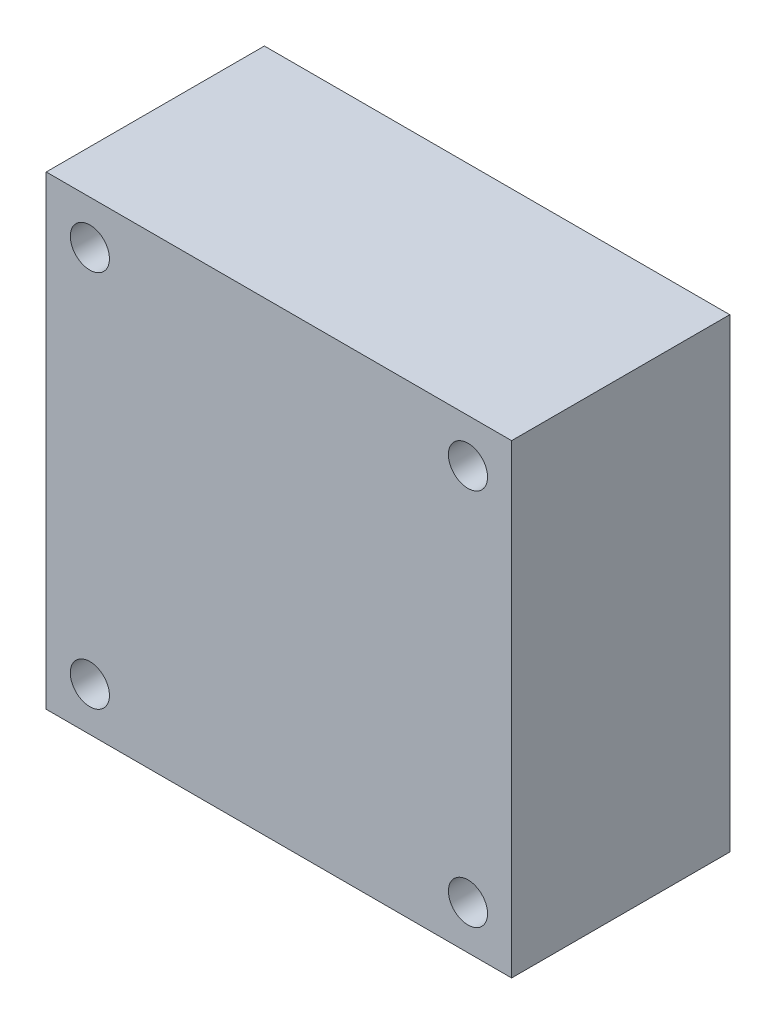
ISO-10303-21;
HEADER;
FILE_DESCRIPTION(('STEP AP214'),'2;1');
FILE_NAME('part.step','',(''),(''),'','','');
FILE_SCHEMA(('AUTOMOTIVE_DESIGN { 1 0 10303 214 1 1 1 1 }'));
ENDSEC;
DATA;
#1=APPLICATION_CONTEXT('core data for automotive mechanical design processes');
#2=APPLICATION_PROTOCOL_DEFINITION('international standard','automotive_design',2000,#1);
#3=PRODUCT_CONTEXT('',#1,'mechanical');
#4=PRODUCT('Part','Part','',(#3));
#5=PRODUCT_RELATED_PRODUCT_CATEGORY('part','',(#4));
#6=PRODUCT_DEFINITION_FORMATION('','',#4);
#7=PRODUCT_DEFINITION_CONTEXT('part definition',#1,'design');
#8=PRODUCT_DEFINITION('design','',#6,#7);
#9=PRODUCT_DEFINITION_SHAPE('','',#8);
#10=(LENGTH_UNIT() NAMED_UNIT(*) SI_UNIT(.MILLI.,.METRE.));
#11=(NAMED_UNIT(*) PLANE_ANGLE_UNIT() SI_UNIT($,.RADIAN.));
#12=(NAMED_UNIT(*) SI_UNIT($,.STERADIAN.) SOLID_ANGLE_UNIT());
#13=UNCERTAINTY_MEASURE_WITH_UNIT(LENGTH_MEASURE(1.E-05),#10,'distance_accuracy_value','');
#14=(GEOMETRIC_REPRESENTATION_CONTEXT(3) GLOBAL_UNCERTAINTY_ASSIGNED_CONTEXT((#13)) GLOBAL_UNIT_ASSIGNED_CONTEXT((#10,
#11,#12)) REPRESENTATION_CONTEXT('',''));
#15=CARTESIAN_POINT('',(0.,0.,0.));
#16=DIRECTION('',(0.,0.,1.));
#17=DIRECTION('',(1.,0.,0.));
#18=AXIS2_PLACEMENT_3D('',#15,#16,#17);
#19=CARTESIAN_POINT('',(0.,0.,15.));
#20=DIRECTION('',(0.,0.,1.));
#21=DIRECTION('',(1.,0.,0.));
#22=AXIS2_PLACEMENT_3D('',#19,#20,#21);
#23=PLANE('',#22);
#24=CARTESIAN_POINT('',(13.,13.,15.));
#25=DIRECTION('',(0.,0.,1.));
#26=DIRECTION('',(1.,0.,0.));
#27=AXIS2_PLACEMENT_3D('',#24,#25,#26);
#28=CIRCLE('',#27,1.3455497382199);
#29=CARTESIAN_POINT('',(14.3455497382199,13.,15.));
#30=VERTEX_POINT('',#29);
#31=EDGE_CURVE('E121',#30,#30,#28,.T.);
#32=ORIENTED_EDGE('',*,*,#31,.F.);
#33=EDGE_LOOP('',(#32));
#34=FACE_BOUND('',#33,.T.);
#35=CARTESIAN_POINT('',(-13.,-13.,15.));
#36=DIRECTION('',(0.,0.,1.));
#37=DIRECTION('',(1.,0.,0.));
#38=AXIS2_PLACEMENT_3D('',#35,#36,#37);
#39=CIRCLE('',#38,1.3455497382199);
#40=CARTESIAN_POINT('',(-11.6544502617801,-13.,15.));
#41=VERTEX_POINT('',#40);
#42=EDGE_CURVE('E100',#41,#41,#39,.T.);
#43=ORIENTED_EDGE('',*,*,#42,.F.);
#44=EDGE_LOOP('',(#43));
#45=FACE_BOUND('',#44,.T.);
#46=DIRECTION('',(0.,-1.,0.));
#47=VECTOR('',#46,1.);
#48=CARTESIAN_POINT('',(-16.,-16.,15.));
#49=LINE('',#48,#47);
#50=CARTESIAN_POINT('',(-16.,16.,15.));
#51=VERTEX_POINT('',#50);
#52=CARTESIAN_POINT('',(-16.,-16.,15.));
#53=VERTEX_POINT('',#52);
#54=EDGE_CURVE('E85',#51,#53,#49,.T.);
#55=ORIENTED_EDGE('',*,*,#54,.T.);
#56=DIRECTION('',(1.,0.,0.));
#57=VECTOR('',#56,1.);
#58=CARTESIAN_POINT('',(16.,-16.,15.));
#59=LINE('',#58,#57);
#60=CARTESIAN_POINT('',(16.,-16.,15.));
#61=VERTEX_POINT('',#60);
#62=EDGE_CURVE('E80',#53,#61,#59,.T.);
#63=ORIENTED_EDGE('',*,*,#62,.T.);
#64=DIRECTION('',(0.,1.,0.));
#65=VECTOR('',#64,1.);
#66=CARTESIAN_POINT('',(16.,-16.,15.));
#67=LINE('',#66,#65);
#68=CARTESIAN_POINT('',(16.,16.,15.));
#69=VERTEX_POINT('',#68);
#70=EDGE_CURVE('E83',#61,#69,#67,.T.);
#71=ORIENTED_EDGE('',*,*,#70,.T.);
#72=DIRECTION('',(-1.,0.,0.));
#73=VECTOR('',#72,1.);
#74=CARTESIAN_POINT('',(16.,16.,15.));
#75=LINE('',#74,#73);
#76=EDGE_CURVE('E50',#69,#51,#75,.T.);
#77=ORIENTED_EDGE('',*,*,#76,.T.);
#78=EDGE_LOOP('',(#55,#63,#71,#77));
#79=FACE_BOUND('',#78,.T.);
#80=CARTESIAN_POINT('',(13.,-13.,15.));
#81=DIRECTION('',(0.,0.,1.));
#82=DIRECTION('',(-1.,0.,0.));
#83=AXIS2_PLACEMENT_3D('',#80,#81,#82);
#84=CIRCLE('',#83,1.3455497382199);
#85=CARTESIAN_POINT('',(11.6544502617801,-13.,15.));
#86=VERTEX_POINT('',#85);
#87=EDGE_CURVE('E115',#86,#86,#84,.T.);
#88=ORIENTED_EDGE('',*,*,#87,.F.);
#89=EDGE_LOOP('',(#88));
#90=FACE_BOUND('',#89,.T.);
#91=CARTESIAN_POINT('',(-13.,13.,15.));
#92=DIRECTION('',(0.,0.,1.));
#93=DIRECTION('',(-1.,0.,0.));
#94=AXIS2_PLACEMENT_3D('',#91,#92,#93);
#95=CIRCLE('',#94,1.3455497382199);
#96=CARTESIAN_POINT('',(-14.3455497382199,13.,15.));
#97=VERTEX_POINT('',#96);
#98=EDGE_CURVE('E127',#97,#97,#95,.T.);
#99=ORIENTED_EDGE('',*,*,#98,.F.);
#100=EDGE_LOOP('',(#99));
#101=FACE_BOUND('',#100,.T.);
#102=ADVANCED_FACE('F33',(#34,#45,#79,#90,#101),#23,.T.);
#103=CARTESIAN_POINT('',(0.,0.,0.));
#104=DIRECTION('',(0.,0.,1.));
#105=DIRECTION('',(1.,0.,0.));
#106=AXIS2_PLACEMENT_3D('',#103,#104,#105);
#107=PLANE('',#106);
#108=DIRECTION('',(0.,-1.,0.));
#109=VECTOR('',#108,1.);
#110=CARTESIAN_POINT('',(-16.,-16.,0.));
#111=LINE('',#110,#109);
#112=CARTESIAN_POINT('',(-16.,16.,0.));
#113=VERTEX_POINT('',#112);
#114=CARTESIAN_POINT('',(-16.,-16.,0.));
#115=VERTEX_POINT('',#114);
#116=EDGE_CURVE('E97',#113,#115,#111,.T.);
#117=ORIENTED_EDGE('',*,*,#116,.F.);
#118=DIRECTION('',(-1.,0.,0.));
#119=VECTOR('',#118,1.);
#120=CARTESIAN_POINT('',(16.,16.,0.));
#121=LINE('',#120,#119);
#122=CARTESIAN_POINT('',(16.,16.,0.));
#123=VERTEX_POINT('',#122);
#124=EDGE_CURVE('E73',#123,#113,#121,.T.);
#125=ORIENTED_EDGE('',*,*,#124,.F.);
#126=DIRECTION('',(0.,1.,0.));
#127=VECTOR('',#126,1.);
#128=CARTESIAN_POINT('',(16.,-16.,0.));
#129=LINE('',#128,#127);
#130=CARTESIAN_POINT('',(16.,-16.,0.));
#131=VERTEX_POINT('',#130);
#132=EDGE_CURVE('E67',#131,#123,#129,.T.);
#133=ORIENTED_EDGE('',*,*,#132,.F.);
#134=DIRECTION('',(1.,0.,0.));
#135=VECTOR('',#134,1.);
#136=CARTESIAN_POINT('',(16.,-16.,0.));
#137=LINE('',#136,#135);
#138=EDGE_CURVE('E89',#115,#131,#137,.T.);
#139=ORIENTED_EDGE('',*,*,#138,.F.);
#140=EDGE_LOOP('',(#117,#125,#133,#139));
#141=FACE_BOUND('',#140,.T.);
#142=CARTESIAN_POINT('',(-13.,-13.,0.));
#143=DIRECTION('',(0.,0.,1.));
#144=DIRECTION('',(1.,0.,0.));
#145=AXIS2_PLACEMENT_3D('',#142,#143,#144);
#146=CIRCLE('',#145,1.3455497382199);
#147=CARTESIAN_POINT('',(-11.6544502617801,-13.,0.));
#148=VERTEX_POINT('',#147);
#149=EDGE_CURVE('E112',#148,#148,#146,.T.);
#150=ORIENTED_EDGE('',*,*,#149,.T.);
#151=EDGE_LOOP('',(#150));
#152=FACE_BOUND('',#151,.T.);
#153=CARTESIAN_POINT('',(13.,-13.,0.));
#154=DIRECTION('',(0.,0.,1.));
#155=DIRECTION('',(-1.,0.,0.));
#156=AXIS2_PLACEMENT_3D('',#153,#154,#155);
#157=CIRCLE('',#156,1.3455497382199);
#158=CARTESIAN_POINT('',(11.6544502617801,-13.,0.));
#159=VERTEX_POINT('',#158);
#160=EDGE_CURVE('E118',#159,#159,#157,.T.);
#161=ORIENTED_EDGE('',*,*,#160,.T.);
#162=EDGE_LOOP('',(#161));
#163=FACE_BOUND('',#162,.T.);
#164=CARTESIAN_POINT('',(13.,13.,0.));
#165=DIRECTION('',(0.,0.,1.));
#166=DIRECTION('',(1.,0.,0.));
#167=AXIS2_PLACEMENT_3D('',#164,#165,#166);
#168=CIRCLE('',#167,1.3455497382199);
#169=CARTESIAN_POINT('',(14.3455497382199,13.,0.));
#170=VERTEX_POINT('',#169);
#171=EDGE_CURVE('E124',#170,#170,#168,.T.);
#172=ORIENTED_EDGE('',*,*,#171,.T.);
#173=EDGE_LOOP('',(#172));
#174=FACE_BOUND('',#173,.T.);
#175=CARTESIAN_POINT('',(-13.,13.,0.));
#176=DIRECTION('',(0.,0.,1.));
#177=DIRECTION('',(-1.,0.,0.));
#178=AXIS2_PLACEMENT_3D('',#175,#176,#177);
#179=CIRCLE('',#178,1.3455497382199);
#180=CARTESIAN_POINT('',(-14.3455497382199,13.,0.));
#181=VERTEX_POINT('',#180);
#182=EDGE_CURVE('E130',#181,#181,#179,.T.);
#183=ORIENTED_EDGE('',*,*,#182,.T.);
#184=EDGE_LOOP('',(#183));
#185=FACE_BOUND('',#184,.T.);
#186=ADVANCED_FACE('F108',(#141,#152,#163,#174,#185),#107,.F.);
#187=CARTESIAN_POINT('',(-16.,-16.,15.));
#188=DIRECTION('',(1.,0.,0.));
#189=DIRECTION('',(0.,0.,-1.));
#190=AXIS2_PLACEMENT_3D('',#187,#188,#189);
#191=PLANE('',#190);
#192=ORIENTED_EDGE('',*,*,#116,.T.);
#193=DIRECTION('',(0.,0.,-1.));
#194=VECTOR('',#193,1.);
#195=CARTESIAN_POINT('',(-16.,-16.,15.));
#196=LINE('',#195,#194);
#197=EDGE_CURVE('E11',#53,#115,#196,.T.);
#198=ORIENTED_EDGE('',*,*,#197,.F.);
#199=ORIENTED_EDGE('',*,*,#54,.F.);
#200=DIRECTION('',(0.,0.,-1.));
#201=VECTOR('',#200,1.);
#202=CARTESIAN_POINT('',(-16.,16.,15.));
#203=LINE('',#202,#201);
#204=EDGE_CURVE('E93',#51,#113,#203,.T.);
#205=ORIENTED_EDGE('',*,*,#204,.T.);
#206=EDGE_LOOP('',(#192,#198,#199,#205));
#207=FACE_BOUND('',#206,.T.);
#208=ADVANCED_FACE('F35',(#207),#191,.F.);
#209=CARTESIAN_POINT('',(16.,-16.,15.));
#210=DIRECTION('',(0.,1.,0.));
#211=DIRECTION('',(0.,0.,1.));
#212=AXIS2_PLACEMENT_3D('',#209,#210,#211);
#213=PLANE('',#212);
#214=ORIENTED_EDGE('',*,*,#138,.T.);
#215=DIRECTION('',(0.,0.,-1.));
#216=VECTOR('',#215,1.);
#217=CARTESIAN_POINT('',(16.,-16.,15.));
#218=LINE('',#217,#216);
#219=EDGE_CURVE('E42',#61,#131,#218,.T.);
#220=ORIENTED_EDGE('',*,*,#219,.F.);
#221=ORIENTED_EDGE('',*,*,#62,.F.);
#222=ORIENTED_EDGE('',*,*,#197,.T.);
#223=EDGE_LOOP('',(#214,#220,#221,#222));
#224=FACE_BOUND('',#223,.T.);
#225=ADVANCED_FACE('F88',(#224),#213,.F.);
#226=CARTESIAN_POINT('',(16.,-16.,15.));
#227=DIRECTION('',(-1.,0.,0.));
#228=DIRECTION('',(0.,0.,1.));
#229=AXIS2_PLACEMENT_3D('',#226,#227,#228);
#230=PLANE('',#229);
#231=ORIENTED_EDGE('',*,*,#132,.T.);
#232=DIRECTION('',(0.,0.,-1.));
#233=VECTOR('',#232,1.);
#234=CARTESIAN_POINT('',(16.,16.,15.));
#235=LINE('',#234,#233);
#236=EDGE_CURVE('E90',#69,#123,#235,.T.);
#237=ORIENTED_EDGE('',*,*,#236,.F.);
#238=ORIENTED_EDGE('',*,*,#70,.F.);
#239=ORIENTED_EDGE('',*,*,#219,.T.);
#240=EDGE_LOOP('',(#231,#237,#238,#239));
#241=FACE_BOUND('',#240,.T.);
#242=ADVANCED_FACE('F91',(#241),#230,.F.);
#243=CARTESIAN_POINT('',(16.,16.,15.));
#244=DIRECTION('',(0.,-1.,0.));
#245=DIRECTION('',(0.,0.,-1.));
#246=AXIS2_PLACEMENT_3D('',#243,#244,#245);
#247=PLANE('',#246);
#248=ORIENTED_EDGE('',*,*,#124,.T.);
#249=ORIENTED_EDGE('',*,*,#204,.F.);
#250=ORIENTED_EDGE('',*,*,#76,.F.);
#251=ORIENTED_EDGE('',*,*,#236,.T.);
#252=EDGE_LOOP('',(#248,#249,#250,#251));
#253=FACE_BOUND('',#252,.T.);
#254=ADVANCED_FACE('F105',(#253),#247,.F.);
#255=CARTESIAN_POINT('',(-13.,-13.,15.));
#256=DIRECTION('',(0.,0.,-1.));
#257=DIRECTION('',(-1.,0.,0.));
#258=AXIS2_PLACEMENT_3D('',#255,#256,#257);
#259=CYLINDRICAL_SURFACE('',#258,1.3455497382199);
#260=ORIENTED_EDGE('',*,*,#42,.T.);
#261=EDGE_LOOP('',(#260));
#262=FACE_BOUND('',#261,.T.);
#263=ORIENTED_EDGE('',*,*,#149,.F.);
#264=EDGE_LOOP('',(#263));
#265=FACE_BOUND('',#264,.T.);
#266=ADVANCED_FACE('F149',(#262,#265),#259,.F.);
#267=CARTESIAN_POINT('',(13.,-13.,15.));
#268=DIRECTION('',(0.,0.,-1.));
#269=DIRECTION('',(-1.,0.,0.));
#270=AXIS2_PLACEMENT_3D('',#267,#268,#269);
#271=CYLINDRICAL_SURFACE('',#270,1.3455497382199);
#272=ORIENTED_EDGE('',*,*,#87,.T.);
#273=EDGE_LOOP('',(#272));
#274=FACE_BOUND('',#273,.T.);
#275=ORIENTED_EDGE('',*,*,#160,.F.);
#276=EDGE_LOOP('',(#275));
#277=FACE_BOUND('',#276,.T.);
#278=ADVANCED_FACE('F195',(#274,#277),#271,.F.);
#279=CARTESIAN_POINT('',(13.,13.,15.));
#280=DIRECTION('',(0.,0.,-1.));
#281=DIRECTION('',(-1.,0.,0.));
#282=AXIS2_PLACEMENT_3D('',#279,#280,#281);
#283=CYLINDRICAL_SURFACE('',#282,1.3455497382199);
#284=ORIENTED_EDGE('',*,*,#31,.T.);
#285=EDGE_LOOP('',(#284));
#286=FACE_BOUND('',#285,.T.);
#287=ORIENTED_EDGE('',*,*,#171,.F.);
#288=EDGE_LOOP('',(#287));
#289=FACE_BOUND('',#288,.T.);
#290=ADVANCED_FACE('F203',(#286,#289),#283,.F.);
#291=CARTESIAN_POINT('',(-13.,13.,15.));
#292=DIRECTION('',(0.,0.,-1.));
#293=DIRECTION('',(-1.,0.,0.));
#294=AXIS2_PLACEMENT_3D('',#291,#292,#293);
#295=CYLINDRICAL_SURFACE('',#294,1.3455497382199);
#296=ORIENTED_EDGE('',*,*,#98,.T.);
#297=EDGE_LOOP('',(#296));
#298=FACE_BOUND('',#297,.T.);
#299=ORIENTED_EDGE('',*,*,#182,.F.);
#300=EDGE_LOOP('',(#299));
#301=FACE_BOUND('',#300,.T.);
#302=ADVANCED_FACE('F136',(#298,#301),#295,.F.);
#303=CLOSED_SHELL('',(#102,#186,#208,#225,#242,#254,#266,#278,#290,#302));
#304=MANIFOLD_SOLID_BREP('B2',#303);
#305=ADVANCED_BREP_SHAPE_REPRESENTATION('',(#18,#304),#14);
#306=SHAPE_DEFINITION_REPRESENTATION(#9,#305);
ENDSEC;
END-ISO-10303-21;
